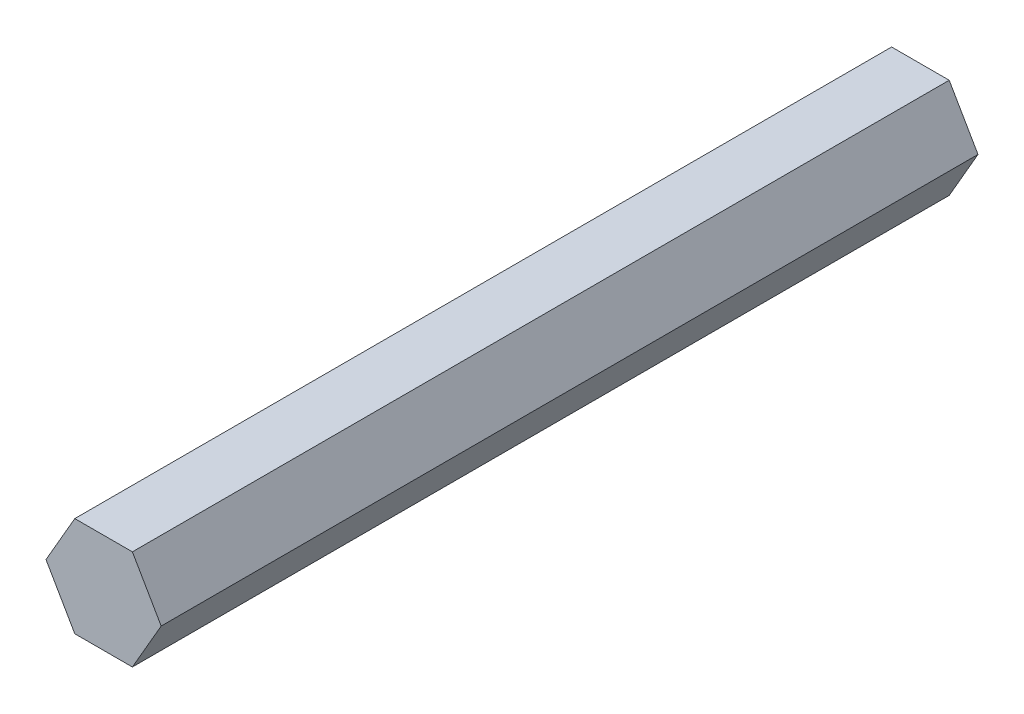
ISO-10303-21;
HEADER;
FILE_DESCRIPTION(('STEP AP214'),'2;1');
FILE_NAME('part.step','',(''),(''),'','','');
FILE_SCHEMA(('AUTOMOTIVE_DESIGN { 1 0 10303 214 1 1 1 1 }'));
ENDSEC;
DATA;
#1=APPLICATION_CONTEXT('core data for automotive mechanical design processes');
#2=APPLICATION_PROTOCOL_DEFINITION('international standard','automotive_design',2000,#1);
#3=PRODUCT_CONTEXT('',#1,'mechanical');
#4=PRODUCT('Part','Part','',(#3));
#5=PRODUCT_RELATED_PRODUCT_CATEGORY('part','',(#4));
#6=PRODUCT_DEFINITION_FORMATION('','',#4);
#7=PRODUCT_DEFINITION_CONTEXT('part definition',#1,'design');
#8=PRODUCT_DEFINITION('design','',#6,#7);
#9=PRODUCT_DEFINITION_SHAPE('','',#8);
#10=(LENGTH_UNIT() NAMED_UNIT(*) SI_UNIT(.MILLI.,.METRE.));
#11=(NAMED_UNIT(*) PLANE_ANGLE_UNIT() SI_UNIT($,.RADIAN.));
#12=(NAMED_UNIT(*) SI_UNIT($,.STERADIAN.) SOLID_ANGLE_UNIT());
#13=UNCERTAINTY_MEASURE_WITH_UNIT(LENGTH_MEASURE(1.E-05),#10,'distance_accuracy_value','');
#14=(GEOMETRIC_REPRESENTATION_CONTEXT(3) GLOBAL_UNCERTAINTY_ASSIGNED_CONTEXT((#13)) GLOBAL_UNIT_ASSIGNED_CONTEXT((#10,
#11,#12)) REPRESENTATION_CONTEXT('',''));
#15=CARTESIAN_POINT('',(0.,0.,0.));
#16=DIRECTION('',(0.,0.,1.));
#17=DIRECTION('',(1.,0.,0.));
#18=AXIS2_PLACEMENT_3D('',#15,#16,#17);
#19=CARTESIAN_POINT('',(3.66617420935412,-6.35000000000001,104.));
#20=DIRECTION('',(-0.866025403784439,0.499999999999999,0.));
#21=DIRECTION('',(-0.499999999999999,-0.866025403784439,0.));
#22=AXIS2_PLACEMENT_3D('',#19,#20,#21);
#23=PLANE('',#22);
#24=DIRECTION('',(0.499999999999999,0.866025403784439,0.));
#25=VECTOR('',#24,1.);
#26=CARTESIAN_POINT('',(3.66617420935412,-6.35000000000001,0.));
#27=LINE('',#26,#25);
#28=CARTESIAN_POINT('',(3.66617420935412,-6.35000000000001,0.));
#29=VERTEX_POINT('',#28);
#30=CARTESIAN_POINT('',(7.33234841870825,0.,0.));
#31=VERTEX_POINT('',#30);
#32=EDGE_CURVE('E117',#29,#31,#27,.T.);
#33=ORIENTED_EDGE('',*,*,#32,.T.);
#34=DIRECTION('',(0.,0.,-1.));
#35=VECTOR('',#34,1.);
#36=CARTESIAN_POINT('',(7.33234841870825,0.,104.));
#37=LINE('',#36,#35);
#38=CARTESIAN_POINT('',(7.33234841870825,0.,104.));
#39=VERTEX_POINT('',#38);
#40=EDGE_CURVE('E11',#39,#31,#37,.T.);
#41=ORIENTED_EDGE('',*,*,#40,.F.);
#42=DIRECTION('',(0.499999999999999,0.866025403784439,0.));
#43=VECTOR('',#42,1.);
#44=CARTESIAN_POINT('',(3.66617420935412,-6.35000000000001,104.));
#45=LINE('',#44,#43);
#46=CARTESIAN_POINT('',(3.66617420935412,-6.35000000000001,104.));
#47=VERTEX_POINT('',#46);
#48=EDGE_CURVE('E127',#47,#39,#45,.T.);
#49=ORIENTED_EDGE('',*,*,#48,.F.);
#50=DIRECTION('',(0.,0.,-1.));
#51=VECTOR('',#50,1.);
#52=CARTESIAN_POINT('',(3.66617420935412,-6.35000000000001,104.));
#53=LINE('',#52,#51);
#54=EDGE_CURVE('E113',#47,#29,#53,.T.);
#55=ORIENTED_EDGE('',*,*,#54,.T.);
#56=EDGE_LOOP('',(#33,#41,#49,#55));
#57=FACE_BOUND('',#56,.T.);
#58=ADVANCED_FACE('F33',(#57),#23,.F.);
#59=CARTESIAN_POINT('',(7.33234841870825,0.,104.));
#60=DIRECTION('',(-0.866025403784438,-0.5,0.));
#61=DIRECTION('',(0.5,-0.866025403784439,0.));
#62=AXIS2_PLACEMENT_3D('',#59,#60,#61);
#63=PLANE('',#62);
#64=DIRECTION('',(-0.5,0.866025403784439,0.));
#65=VECTOR('',#64,1.);
#66=CARTESIAN_POINT('',(7.33234841870825,0.,0.));
#67=LINE('',#66,#65);
#68=CARTESIAN_POINT('',(3.66617420935412,6.35000000000001,0.));
#69=VERTEX_POINT('',#68);
#70=EDGE_CURVE('E120',#31,#69,#67,.T.);
#71=ORIENTED_EDGE('',*,*,#70,.T.);
#72=DIRECTION('',(0.,0.,-1.));
#73=VECTOR('',#72,1.);
#74=CARTESIAN_POINT('',(3.66617420935412,6.35000000000001,104.));
#75=LINE('',#74,#73);
#76=CARTESIAN_POINT('',(3.66617420935412,6.35000000000001,104.));
#77=VERTEX_POINT('',#76);
#78=EDGE_CURVE('E41',#77,#69,#75,.T.);
#79=ORIENTED_EDGE('',*,*,#78,.F.);
#80=DIRECTION('',(-0.5,0.866025403784439,0.));
#81=VECTOR('',#80,1.);
#82=CARTESIAN_POINT('',(7.33234841870825,0.,104.));
#83=LINE('',#82,#81);
#84=EDGE_CURVE('E86',#39,#77,#83,.T.);
#85=ORIENTED_EDGE('',*,*,#84,.F.);
#86=ORIENTED_EDGE('',*,*,#40,.T.);
#87=EDGE_LOOP('',(#71,#79,#85,#86));
#88=FACE_BOUND('',#87,.T.);
#89=ADVANCED_FACE('F151',(#88),#63,.F.);
#90=CARTESIAN_POINT('',(3.66617420935412,6.35000000000001,104.));
#91=DIRECTION('',(0.,-1.,0.));
#92=DIRECTION('',(0.,0.,-1.));
#93=AXIS2_PLACEMENT_3D('',#90,#91,#92);
#94=PLANE('',#93);
#95=DIRECTION('',(-1.,0.,0.));
#96=VECTOR('',#95,1.);
#97=CARTESIAN_POINT('',(3.66617420935412,6.35000000000001,0.));
#98=LINE('',#97,#96);
#99=CARTESIAN_POINT('',(-3.66617420935413,6.35000000000001,0.));
#100=VERTEX_POINT('',#99);
#101=EDGE_CURVE('E122',#69,#100,#98,.T.);
#102=ORIENTED_EDGE('',*,*,#101,.T.);
#103=DIRECTION('',(0.,0.,-1.));
#104=VECTOR('',#103,1.);
#105=CARTESIAN_POINT('',(-3.66617420935413,6.35000000000001,104.));
#106=LINE('',#105,#104);
#107=CARTESIAN_POINT('',(-3.66617420935413,6.35000000000001,104.));
#108=VERTEX_POINT('',#107);
#109=EDGE_CURVE('E108',#108,#100,#106,.T.);
#110=ORIENTED_EDGE('',*,*,#109,.F.);
#111=DIRECTION('',(-1.,0.,0.));
#112=VECTOR('',#111,1.);
#113=CARTESIAN_POINT('',(3.66617420935412,6.35000000000001,104.));
#114=LINE('',#113,#112);
#115=EDGE_CURVE('E99',#77,#108,#114,.T.);
#116=ORIENTED_EDGE('',*,*,#115,.F.);
#117=ORIENTED_EDGE('',*,*,#78,.T.);
#118=EDGE_LOOP('',(#102,#110,#116,#117));
#119=FACE_BOUND('',#118,.T.);
#120=ADVANCED_FACE('F133',(#119),#94,.F.);
#121=CARTESIAN_POINT('',(-3.66617420935413,6.35000000000001,104.));
#122=DIRECTION('',(0.866025403784439,-0.5,0.));
#123=DIRECTION('',(0.5,0.866025403784439,0.));
#124=AXIS2_PLACEMENT_3D('',#121,#122,#123);
#125=PLANE('',#124);
#126=DIRECTION('',(-0.5,-0.866025403784439,0.));
#127=VECTOR('',#126,1.);
#128=CARTESIAN_POINT('',(-3.66617420935413,6.35000000000001,0.));
#129=LINE('',#128,#127);
#130=CARTESIAN_POINT('',(-7.33234841870826,0.,0.));
#131=VERTEX_POINT('',#130);
#132=EDGE_CURVE('E107',#100,#131,#129,.T.);
#133=ORIENTED_EDGE('',*,*,#132,.T.);
#134=DIRECTION('',(0.,0.,-1.));
#135=VECTOR('',#134,1.);
#136=CARTESIAN_POINT('',(-7.33234841870826,0.,104.));
#137=LINE('',#136,#135);
#138=CARTESIAN_POINT('',(-7.33234841870826,0.,104.));
#139=VERTEX_POINT('',#138);
#140=EDGE_CURVE('E104',#139,#131,#137,.T.);
#141=ORIENTED_EDGE('',*,*,#140,.F.);
#142=DIRECTION('',(-0.5,-0.866025403784439,0.));
#143=VECTOR('',#142,1.);
#144=CARTESIAN_POINT('',(-3.66617420935413,6.35000000000001,104.));
#145=LINE('',#144,#143);
#146=EDGE_CURVE('E93',#108,#139,#145,.T.);
#147=ORIENTED_EDGE('',*,*,#146,.F.);
#148=ORIENTED_EDGE('',*,*,#109,.T.);
#149=EDGE_LOOP('',(#133,#141,#147,#148));
#150=FACE_BOUND('',#149,.T.);
#151=ADVANCED_FACE('F105',(#150),#125,.F.);
#152=CARTESIAN_POINT('',(-7.33234841870826,0.,104.));
#153=DIRECTION('',(0.866025403784439,0.5,0.));
#154=DIRECTION('',(-0.5,0.866025403784439,0.));
#155=AXIS2_PLACEMENT_3D('',#152,#153,#154);
#156=PLANE('',#155);
#157=DIRECTION('',(0.5,-0.866025403784439,0.));
#158=VECTOR('',#157,1.);
#159=CARTESIAN_POINT('',(-7.33234841870826,0.,0.));
#160=LINE('',#159,#158);
#161=CARTESIAN_POINT('',(-3.66617420935413,-6.35000000000001,0.));
#162=VERTEX_POINT('',#161);
#163=EDGE_CURVE('E72',#131,#162,#160,.T.);
#164=ORIENTED_EDGE('',*,*,#163,.T.);
#165=DIRECTION('',(0.,0.,-1.));
#166=VECTOR('',#165,1.);
#167=CARTESIAN_POINT('',(-3.66617420935413,-6.35000000000001,104.));
#168=LINE('',#167,#166);
#169=CARTESIAN_POINT('',(-3.66617420935413,-6.35000000000001,104.));
#170=VERTEX_POINT('',#169);
#171=EDGE_CURVE('E109',#170,#162,#168,.T.);
#172=ORIENTED_EDGE('',*,*,#171,.F.);
#173=DIRECTION('',(0.5,-0.866025403784439,0.));
#174=VECTOR('',#173,1.);
#175=CARTESIAN_POINT('',(-7.33234841870826,0.,104.));
#176=LINE('',#175,#174);
#177=EDGE_CURVE('E97',#139,#170,#176,.T.);
#178=ORIENTED_EDGE('',*,*,#177,.F.);
#179=ORIENTED_EDGE('',*,*,#140,.T.);
#180=EDGE_LOOP('',(#164,#172,#178,#179));
#181=FACE_BOUND('',#180,.T.);
#182=ADVANCED_FACE('F111',(#181),#156,.F.);
#183=CARTESIAN_POINT('',(-3.66617420935413,-6.35000000000001,104.));
#184=DIRECTION('',(0.,1.,0.));
#185=DIRECTION('',(-1.,0.,0.));
#186=AXIS2_PLACEMENT_3D('',#183,#184,#185);
#187=PLANE('',#186);
#188=DIRECTION('',(1.,0.,0.));
#189=VECTOR('',#188,1.);
#190=CARTESIAN_POINT('',(-3.66617420935413,-6.35000000000001,0.));
#191=LINE('',#190,#189);
#192=EDGE_CURVE('E78',#162,#29,#191,.T.);
#193=ORIENTED_EDGE('',*,*,#192,.T.);
#194=ORIENTED_EDGE('',*,*,#54,.F.);
#195=DIRECTION('',(1.,0.,0.));
#196=VECTOR('',#195,1.);
#197=CARTESIAN_POINT('',(-3.66617420935413,-6.35000000000001,104.));
#198=LINE('',#197,#196);
#199=EDGE_CURVE('E49',#170,#47,#198,.T.);
#200=ORIENTED_EDGE('',*,*,#199,.F.);
#201=ORIENTED_EDGE('',*,*,#171,.T.);
#202=EDGE_LOOP('',(#193,#194,#200,#201));
#203=FACE_BOUND('',#202,.T.);
#204=ADVANCED_FACE('F140',(#203),#187,.F.);
#205=CARTESIAN_POINT('',(0.,0.,104.));
#206=DIRECTION('',(0.,0.,1.));
#207=DIRECTION('',(1.,0.,0.));
#208=AXIS2_PLACEMENT_3D('',#205,#206,#207);
#209=PLANE('',#208);
#210=ORIENTED_EDGE('',*,*,#48,.T.);
#211=ORIENTED_EDGE('',*,*,#84,.T.);
#212=ORIENTED_EDGE('',*,*,#115,.T.);
#213=ORIENTED_EDGE('',*,*,#146,.T.);
#214=ORIENTED_EDGE('',*,*,#177,.T.);
#215=ORIENTED_EDGE('',*,*,#199,.T.);
#216=EDGE_LOOP('',(#210,#211,#212,#213,#214,#215));
#217=FACE_BOUND('',#216,.T.);
#218=ADVANCED_FACE('F95',(#217),#209,.T.);
#219=CARTESIAN_POINT('',(0.,0.,0.));
#220=DIRECTION('',(0.,0.,1.));
#221=DIRECTION('',(1.,0.,0.));
#222=AXIS2_PLACEMENT_3D('',#219,#220,#221);
#223=PLANE('',#222);
#224=ORIENTED_EDGE('',*,*,#32,.F.);
#225=ORIENTED_EDGE('',*,*,#192,.F.);
#226=ORIENTED_EDGE('',*,*,#163,.F.);
#227=ORIENTED_EDGE('',*,*,#132,.F.);
#228=ORIENTED_EDGE('',*,*,#101,.F.);
#229=ORIENTED_EDGE('',*,*,#70,.F.);
#230=EDGE_LOOP('',(#224,#225,#226,#227,#228,#229));
#231=FACE_BOUND('',#230,.T.);
#232=ADVANCED_FACE('F136',(#231),#223,.F.);
#233=CLOSED_SHELL('',(#58,#89,#120,#151,#182,#204,#218,#232));
#234=MANIFOLD_SOLID_BREP('B2',#233);
#235=ADVANCED_BREP_SHAPE_REPRESENTATION('',(#18,#234),#14);
#236=SHAPE_DEFINITION_REPRESENTATION(#9,#235);
ENDSEC;
END-ISO-10303-21;
